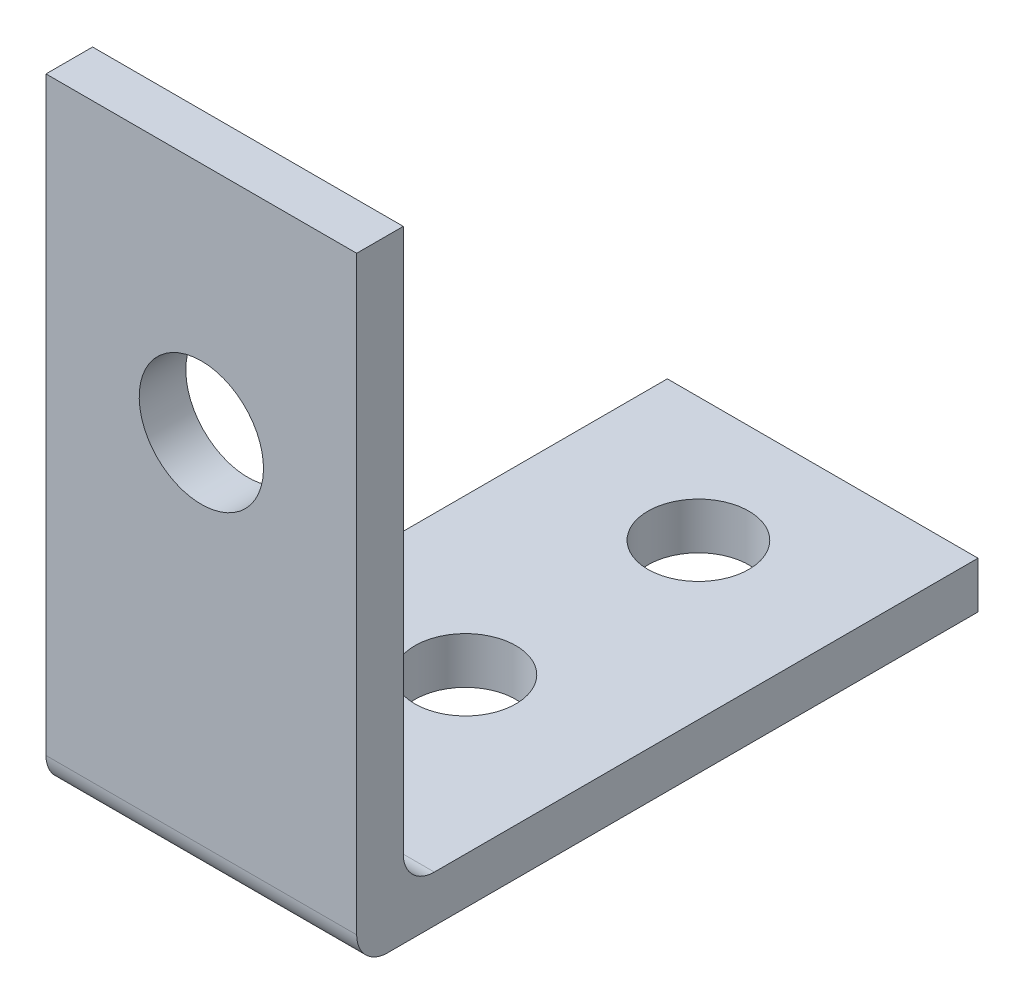
ISO-10303-21;
HEADER;
FILE_DESCRIPTION(('STEP AP214'),'2;1');
FILE_NAME('part.step','',(''),(''),'','','');
FILE_SCHEMA(('AUTOMOTIVE_DESIGN { 1 0 10303 214 1 1 1 1 }'));
ENDSEC;
DATA;
#1=APPLICATION_CONTEXT('core data for automotive mechanical design processes');
#2=APPLICATION_PROTOCOL_DEFINITION('international standard','automotive_design',2000,#1);
#3=PRODUCT_CONTEXT('',#1,'mechanical');
#4=PRODUCT('Part','Part','',(#3));
#5=PRODUCT_RELATED_PRODUCT_CATEGORY('part','',(#4));
#6=PRODUCT_DEFINITION_FORMATION('','',#4);
#7=PRODUCT_DEFINITION_CONTEXT('part definition',#1,'design');
#8=PRODUCT_DEFINITION('design','',#6,#7);
#9=PRODUCT_DEFINITION_SHAPE('','',#8);
#10=(LENGTH_UNIT() NAMED_UNIT(*) SI_UNIT(.MILLI.,.METRE.));
#11=(NAMED_UNIT(*) PLANE_ANGLE_UNIT() SI_UNIT($,.RADIAN.));
#12=(NAMED_UNIT(*) SI_UNIT($,.STERADIAN.) SOLID_ANGLE_UNIT());
#13=UNCERTAINTY_MEASURE_WITH_UNIT(LENGTH_MEASURE(1.E-05),#10,'distance_accuracy_value','');
#14=(GEOMETRIC_REPRESENTATION_CONTEXT(3) GLOBAL_UNCERTAINTY_ASSIGNED_CONTEXT((#13)) GLOBAL_UNIT_ASSIGNED_CONTEXT((#10,
#11,#12)) REPRESENTATION_CONTEXT('',''));
#15=CARTESIAN_POINT('',(0.,0.,0.));
#16=DIRECTION('',(0.,0.,1.));
#17=DIRECTION('',(1.,0.,0.));
#18=AXIS2_PLACEMENT_3D('',#15,#16,#17);
#19=CARTESIAN_POINT('',(20.,40.,0.));
#20=DIRECTION('',(0.,-1.,0.));
#21=DIRECTION('',(0.,0.,-1.));
#22=AXIS2_PLACEMENT_3D('',#19,#20,#21);
#23=PLANE('',#22);
#24=DIRECTION('',(0.,0.,1.));
#25=VECTOR('',#24,1.);
#26=CARTESIAN_POINT('',(0.,40.,0.));
#27=LINE('',#26,#25);
#28=CARTESIAN_POINT('',(0.,40.,-3.));
#29=VERTEX_POINT('',#28);
#30=CARTESIAN_POINT('',(0.,40.,0.));
#31=VERTEX_POINT('',#30);
#32=EDGE_CURVE('E150',#29,#31,#27,.T.);
#33=ORIENTED_EDGE('',*,*,#32,.T.);
#34=DIRECTION('',(-1.,0.,0.));
#35=VECTOR('',#34,1.);
#36=CARTESIAN_POINT('',(20.,40.,0.));
#37=LINE('',#36,#35);
#38=CARTESIAN_POINT('',(20.,40.,0.));
#39=VERTEX_POINT('',#38);
#40=EDGE_CURVE('E11',#39,#31,#37,.T.);
#41=ORIENTED_EDGE('',*,*,#40,.F.);
#42=DIRECTION('',(0.,0.,1.));
#43=VECTOR('',#42,1.);
#44=CARTESIAN_POINT('',(20.,40.,0.));
#45=LINE('',#44,#43);
#46=CARTESIAN_POINT('',(20.,40.,-3.));
#47=VERTEX_POINT('',#46);
#48=EDGE_CURVE('E173',#47,#39,#45,.T.);
#49=ORIENTED_EDGE('',*,*,#48,.F.);
#50=DIRECTION('',(-1.,0.,0.));
#51=VECTOR('',#50,1.);
#52=CARTESIAN_POINT('',(20.,40.,-3.));
#53=LINE('',#52,#51);
#54=EDGE_CURVE('E146',#47,#29,#53,.T.);
#55=ORIENTED_EDGE('',*,*,#54,.T.);
#56=EDGE_LOOP('',(#33,#41,#49,#55));
#57=FACE_BOUND('',#56,.T.);
#58=ADVANCED_FACE('F49',(#57),#23,.F.);
#59=CARTESIAN_POINT('',(20.,2.,0.));
#60=DIRECTION('',(0.,0.,-1.));
#61=DIRECTION('',(0.,1.,0.));
#62=AXIS2_PLACEMENT_3D('',#59,#60,#61);
#63=PLANE('',#62);
#64=CARTESIAN_POINT('',(10.,25.,0.));
#65=DIRECTION('',(0.,0.,-1.));
#66=DIRECTION('',(0.,1.,0.));
#67=AXIS2_PLACEMENT_3D('',#64,#65,#66);
#68=CIRCLE('',#67,4.);
#69=CARTESIAN_POINT('',(10.,29.,0.));
#70=VERTEX_POINT('',#69);
#71=EDGE_CURVE('E155',#70,#70,#68,.T.);
#72=ORIENTED_EDGE('',*,*,#71,.T.);
#73=EDGE_LOOP('',(#72));
#74=FACE_BOUND('',#73,.T.);
#75=DIRECTION('',(0.,-1.,0.));
#76=VECTOR('',#75,1.);
#77=CARTESIAN_POINT('',(0.,2.,0.));
#78=LINE('',#77,#76);
#79=CARTESIAN_POINT('',(0.,2.,0.));
#80=VERTEX_POINT('',#79);
#81=EDGE_CURVE('E154',#31,#80,#78,.T.);
#82=ORIENTED_EDGE('',*,*,#81,.T.);
#83=DIRECTION('',(-1.,0.,0.));
#84=VECTOR('',#83,1.);
#85=CARTESIAN_POINT('',(20.,2.,0.));
#86=LINE('',#85,#84);
#87=CARTESIAN_POINT('',(20.,2.,0.));
#88=VERTEX_POINT('',#87);
#89=EDGE_CURVE('E58',#88,#80,#86,.T.);
#90=ORIENTED_EDGE('',*,*,#89,.F.);
#91=DIRECTION('',(0.,-1.,0.));
#92=VECTOR('',#91,1.);
#93=CARTESIAN_POINT('',(20.,2.,0.));
#94=LINE('',#93,#92);
#95=EDGE_CURVE('E109',#39,#88,#94,.T.);
#96=ORIENTED_EDGE('',*,*,#95,.F.);
#97=ORIENTED_EDGE('',*,*,#40,.T.);
#98=EDGE_LOOP('',(#82,#90,#96,#97));
#99=FACE_BOUND('',#98,.T.);
#100=ADVANCED_FACE('F267',(#74,#99),#63,.F.);
#101=CARTESIAN_POINT('',(20.,2.,-2.));
#102=DIRECTION('',(-1.,0.,0.));
#103=DIRECTION('',(0.,0.,1.));
#104=AXIS2_PLACEMENT_3D('',#101,#102,#103);
#105=CYLINDRICAL_SURFACE('',#104,2.);
#106=CARTESIAN_POINT('',(0.,2.,-2.));
#107=DIRECTION('',(1.,0.,0.));
#108=DIRECTION('',(0.,0.,1.));
#109=AXIS2_PLACEMENT_3D('',#106,#107,#108);
#110=CIRCLE('',#109,2.);
#111=CARTESIAN_POINT('',(0.,0.,-2.));
#112=VERTEX_POINT('',#111);
#113=EDGE_CURVE('E158',#80,#112,#110,.T.);
#114=ORIENTED_EDGE('',*,*,#113,.T.);
#115=DIRECTION('',(-1.,0.,0.));
#116=VECTOR('',#115,1.);
#117=CARTESIAN_POINT('',(20.,0.,-2.));
#118=LINE('',#117,#116);
#119=CARTESIAN_POINT('',(20.,0.,-2.));
#120=VERTEX_POINT('',#119);
#121=EDGE_CURVE('E184',#120,#112,#118,.T.);
#122=ORIENTED_EDGE('',*,*,#121,.F.);
#123=CARTESIAN_POINT('',(20.,2.,-2.));
#124=DIRECTION('',(1.,0.,0.));
#125=DIRECTION('',(0.,0.,1.));
#126=AXIS2_PLACEMENT_3D('',#123,#124,#125);
#127=CIRCLE('',#126,2.);
#128=EDGE_CURVE('E194',#88,#120,#127,.T.);
#129=ORIENTED_EDGE('',*,*,#128,.F.);
#130=ORIENTED_EDGE('',*,*,#89,.T.);
#131=EDGE_LOOP('',(#114,#122,#129,#130));
#132=FACE_BOUND('',#131,.T.);
#133=ADVANCED_FACE('F192',(#132),#105,.T.);
#134=CARTESIAN_POINT('',(20.,0.,-40.));
#135=DIRECTION('',(0.,1.,0.));
#136=DIRECTION('',(0.,0.,1.));
#137=AXIS2_PLACEMENT_3D('',#134,#135,#136);
#138=PLANE('',#137);
#139=CARTESIAN_POINT('',(10.,0.,-32.));
#140=DIRECTION('',(0.,1.,0.));
#141=DIRECTION('',(0.,0.,1.));
#142=AXIS2_PLACEMENT_3D('',#139,#140,#141);
#143=CIRCLE('',#142,3.25);
#144=CARTESIAN_POINT('',(10.,0.,-28.75));
#145=VERTEX_POINT('',#144);
#146=EDGE_CURVE('E221',#145,#145,#143,.T.);
#147=ORIENTED_EDGE('',*,*,#146,.T.);
#148=EDGE_LOOP('',(#147));
#149=FACE_BOUND('',#148,.T.);
#150=CARTESIAN_POINT('',(10.,0.,-17.));
#151=DIRECTION('',(0.,1.,0.));
#152=DIRECTION('',(0.,0.,1.));
#153=AXIS2_PLACEMENT_3D('',#150,#151,#152);
#154=CIRCLE('',#153,3.25);
#155=CARTESIAN_POINT('',(10.,0.,-13.75));
#156=VERTEX_POINT('',#155);
#157=EDGE_CURVE('E225',#156,#156,#154,.T.);
#158=ORIENTED_EDGE('',*,*,#157,.T.);
#159=EDGE_LOOP('',(#158));
#160=FACE_BOUND('',#159,.T.);
#161=DIRECTION('',(0.,0.,-1.));
#162=VECTOR('',#161,1.);
#163=CARTESIAN_POINT('',(0.,0.,-40.));
#164=LINE('',#163,#162);
#165=CARTESIAN_POINT('',(0.,0.,-40.));
#166=VERTEX_POINT('',#165);
#167=EDGE_CURVE('E161',#112,#166,#164,.T.);
#168=ORIENTED_EDGE('',*,*,#167,.T.);
#169=DIRECTION('',(-1.,0.,0.));
#170=VECTOR('',#169,1.);
#171=CARTESIAN_POINT('',(20.,0.,-40.));
#172=LINE('',#171,#170);
#173=CARTESIAN_POINT('',(20.,0.,-40.));
#174=VERTEX_POINT('',#173);
#175=EDGE_CURVE('E180',#174,#166,#172,.T.);
#176=ORIENTED_EDGE('',*,*,#175,.F.);
#177=DIRECTION('',(0.,0.,-1.));
#178=VECTOR('',#177,1.);
#179=CARTESIAN_POINT('',(20.,0.,-40.));
#180=LINE('',#179,#178);
#181=EDGE_CURVE('E207',#120,#174,#180,.T.);
#182=ORIENTED_EDGE('',*,*,#181,.F.);
#183=ORIENTED_EDGE('',*,*,#121,.T.);
#184=EDGE_LOOP('',(#168,#176,#182,#183));
#185=FACE_BOUND('',#184,.T.);
#186=ADVANCED_FACE('F202',(#149,#160,#185),#138,.F.);
#187=CARTESIAN_POINT('',(20.,3.,-40.));
#188=DIRECTION('',(0.,0.,1.));
#189=DIRECTION('',(1.,0.,0.));
#190=AXIS2_PLACEMENT_3D('',#187,#188,#189);
#191=PLANE('',#190);
#192=DIRECTION('',(0.,1.,0.));
#193=VECTOR('',#192,1.);
#194=CARTESIAN_POINT('',(0.,3.,-40.));
#195=LINE('',#194,#193);
#196=CARTESIAN_POINT('',(0.,3.,-40.));
#197=VERTEX_POINT('',#196);
#198=EDGE_CURVE('E164',#166,#197,#195,.T.);
#199=ORIENTED_EDGE('',*,*,#198,.T.);
#200=DIRECTION('',(-1.,0.,0.));
#201=VECTOR('',#200,1.);
#202=CARTESIAN_POINT('',(20.,3.,-40.));
#203=LINE('',#202,#201);
#204=CARTESIAN_POINT('',(20.,3.,-40.));
#205=VERTEX_POINT('',#204);
#206=EDGE_CURVE('E139',#205,#197,#203,.T.);
#207=ORIENTED_EDGE('',*,*,#206,.F.);
#208=DIRECTION('',(0.,1.,0.));
#209=VECTOR('',#208,1.);
#210=CARTESIAN_POINT('',(20.,3.,-40.));
#211=LINE('',#210,#209);
#212=EDGE_CURVE('E128',#174,#205,#211,.T.);
#213=ORIENTED_EDGE('',*,*,#212,.F.);
#214=ORIENTED_EDGE('',*,*,#175,.T.);
#215=EDGE_LOOP('',(#199,#207,#213,#214));
#216=FACE_BOUND('',#215,.T.);
#217=ADVANCED_FACE('F205',(#216),#191,.F.);
#218=CARTESIAN_POINT('',(20.,3.,-5.));
#219=DIRECTION('',(0.,-1.,0.));
#220=DIRECTION('',(0.,0.,-1.));
#221=AXIS2_PLACEMENT_3D('',#218,#219,#220);
#222=PLANE('',#221);
#223=CARTESIAN_POINT('',(10.,3.,-32.));
#224=DIRECTION('',(0.,1.,0.));
#225=DIRECTION('',(0.,0.,1.));
#226=AXIS2_PLACEMENT_3D('',#223,#224,#225);
#227=CIRCLE('',#226,3.25);
#228=CARTESIAN_POINT('',(10.,3.,-28.75));
#229=VERTEX_POINT('',#228);
#230=EDGE_CURVE('E233',#229,#229,#227,.T.);
#231=ORIENTED_EDGE('',*,*,#230,.F.);
#232=EDGE_LOOP('',(#231));
#233=FACE_BOUND('',#232,.T.);
#234=CARTESIAN_POINT('',(10.,3.,-17.));
#235=DIRECTION('',(0.,1.,0.));
#236=DIRECTION('',(0.,0.,1.));
#237=AXIS2_PLACEMENT_3D('',#234,#235,#236);
#238=CIRCLE('',#237,3.25);
#239=CARTESIAN_POINT('',(10.,3.,-13.75));
#240=VERTEX_POINT('',#239);
#241=EDGE_CURVE('E229',#240,#240,#238,.T.);
#242=ORIENTED_EDGE('',*,*,#241,.F.);
#243=EDGE_LOOP('',(#242));
#244=FACE_BOUND('',#243,.T.);
#245=DIRECTION('',(0.,0.,1.));
#246=VECTOR('',#245,1.);
#247=CARTESIAN_POINT('',(0.,3.,-5.));
#248=LINE('',#247,#246);
#249=CARTESIAN_POINT('',(0.,3.,-5.));
#250=VERTEX_POINT('',#249);
#251=EDGE_CURVE('E137',#197,#250,#248,.T.);
#252=ORIENTED_EDGE('',*,*,#251,.T.);
#253=DIRECTION('',(-1.,0.,0.));
#254=VECTOR('',#253,1.);
#255=CARTESIAN_POINT('',(20.,3.,-5.));
#256=LINE('',#255,#254);
#257=CARTESIAN_POINT('',(20.,3.,-5.));
#258=VERTEX_POINT('',#257);
#259=EDGE_CURVE('E134',#258,#250,#256,.T.);
#260=ORIENTED_EDGE('',*,*,#259,.F.);
#261=DIRECTION('',(0.,0.,1.));
#262=VECTOR('',#261,1.);
#263=CARTESIAN_POINT('',(20.,3.,-5.));
#264=LINE('',#263,#262);
#265=EDGE_CURVE('E122',#205,#258,#264,.T.);
#266=ORIENTED_EDGE('',*,*,#265,.F.);
#267=ORIENTED_EDGE('',*,*,#206,.T.);
#268=EDGE_LOOP('',(#252,#260,#266,#267));
#269=FACE_BOUND('',#268,.T.);
#270=ADVANCED_FACE('F135',(#233,#244,#269),#222,.F.);
#271=CARTESIAN_POINT('',(20.,5.,-5.));
#272=DIRECTION('',(-1.,0.,0.));
#273=DIRECTION('',(0.,0.,1.));
#274=AXIS2_PLACEMENT_3D('',#271,#272,#273);
#275=CYLINDRICAL_SURFACE('',#274,2.);
#276=CARTESIAN_POINT('',(0.,5.,-5.));
#277=DIRECTION('',(-1.,0.,0.));
#278=DIRECTION('',(0.,0.,1.));
#279=AXIS2_PLACEMENT_3D('',#276,#277,#278);
#280=CIRCLE('',#279,2.);
#281=CARTESIAN_POINT('',(0.,5.,-3.));
#282=VERTEX_POINT('',#281);
#283=EDGE_CURVE('E95',#250,#282,#280,.T.);
#284=ORIENTED_EDGE('',*,*,#283,.T.);
#285=DIRECTION('',(-1.,0.,0.));
#286=VECTOR('',#285,1.);
#287=CARTESIAN_POINT('',(20.,5.,-3.));
#288=LINE('',#287,#286);
#289=CARTESIAN_POINT('',(20.,5.,-3.));
#290=VERTEX_POINT('',#289);
#291=EDGE_CURVE('E140',#290,#282,#288,.T.);
#292=ORIENTED_EDGE('',*,*,#291,.F.);
#293=CARTESIAN_POINT('',(20.,5.,-5.));
#294=DIRECTION('',(-1.,0.,0.));
#295=DIRECTION('',(0.,0.,1.));
#296=AXIS2_PLACEMENT_3D('',#293,#294,#295);
#297=CIRCLE('',#296,2.);
#298=EDGE_CURVE('E126',#258,#290,#297,.T.);
#299=ORIENTED_EDGE('',*,*,#298,.F.);
#300=ORIENTED_EDGE('',*,*,#259,.T.);
#301=EDGE_LOOP('',(#284,#292,#299,#300));
#302=FACE_BOUND('',#301,.T.);
#303=ADVANCED_FACE('F142',(#302),#275,.F.);
#304=CARTESIAN_POINT('',(20.,40.,-3.));
#305=DIRECTION('',(0.,0.,1.));
#306=DIRECTION('',(0.,-1.,0.));
#307=AXIS2_PLACEMENT_3D('',#304,#305,#306);
#308=PLANE('',#307);
#309=CARTESIAN_POINT('',(10.,25.,-3.));
#310=DIRECTION('',(0.,0.,-1.));
#311=DIRECTION('',(0.,1.,0.));
#312=AXIS2_PLACEMENT_3D('',#309,#310,#311);
#313=CIRCLE('',#312,4.);
#314=CARTESIAN_POINT('',(10.,29.,-3.));
#315=VERTEX_POINT('',#314);
#316=EDGE_CURVE('E217',#315,#315,#313,.T.);
#317=ORIENTED_EDGE('',*,*,#316,.F.);
#318=EDGE_LOOP('',(#317));
#319=FACE_BOUND('',#318,.T.);
#320=DIRECTION('',(0.,1.,0.));
#321=VECTOR('',#320,1.);
#322=CARTESIAN_POINT('',(0.,40.,-3.));
#323=LINE('',#322,#321);
#324=EDGE_CURVE('E101',#282,#29,#323,.T.);
#325=ORIENTED_EDGE('',*,*,#324,.T.);
#326=ORIENTED_EDGE('',*,*,#54,.F.);
#327=DIRECTION('',(0.,1.,0.));
#328=VECTOR('',#327,1.);
#329=CARTESIAN_POINT('',(20.,40.,-3.));
#330=LINE('',#329,#328);
#331=EDGE_CURVE('E66',#290,#47,#330,.T.);
#332=ORIENTED_EDGE('',*,*,#331,.F.);
#333=ORIENTED_EDGE('',*,*,#291,.T.);
#334=EDGE_LOOP('',(#325,#326,#332,#333));
#335=FACE_BOUND('',#334,.T.);
#336=ADVANCED_FACE('F275',(#319,#335),#308,.F.);
#337=CARTESIAN_POINT('',(20.,5.,-5.));
#338=DIRECTION('',(-1.,0.,0.));
#339=DIRECTION('',(0.,0.,1.));
#340=AXIS2_PLACEMENT_3D('',#337,#338,#339);
#341=PLANE('',#340);
#342=ORIENTED_EDGE('',*,*,#48,.T.);
#343=ORIENTED_EDGE('',*,*,#95,.T.);
#344=ORIENTED_EDGE('',*,*,#128,.T.);
#345=ORIENTED_EDGE('',*,*,#181,.T.);
#346=ORIENTED_EDGE('',*,*,#212,.T.);
#347=ORIENTED_EDGE('',*,*,#265,.T.);
#348=ORIENTED_EDGE('',*,*,#298,.T.);
#349=ORIENTED_EDGE('',*,*,#331,.T.);
#350=EDGE_LOOP('',(#342,#343,#344,#345,#346,#347,#348,#349));
#351=FACE_BOUND('',#350,.T.);
#352=ADVANCED_FACE('F124',(#351),#341,.F.);
#353=CARTESIAN_POINT('',(0.,5.,-5.));
#354=DIRECTION('',(-1.,0.,0.));
#355=DIRECTION('',(0.,0.,1.));
#356=AXIS2_PLACEMENT_3D('',#353,#354,#355);
#357=PLANE('',#356);
#358=ORIENTED_EDGE('',*,*,#32,.F.);
#359=ORIENTED_EDGE('',*,*,#324,.F.);
#360=ORIENTED_EDGE('',*,*,#283,.F.);
#361=ORIENTED_EDGE('',*,*,#251,.F.);
#362=ORIENTED_EDGE('',*,*,#198,.F.);
#363=ORIENTED_EDGE('',*,*,#167,.F.);
#364=ORIENTED_EDGE('',*,*,#113,.F.);
#365=ORIENTED_EDGE('',*,*,#81,.F.);
#366=EDGE_LOOP('',(#358,#359,#360,#361,#362,#363,#364,#365));
#367=FACE_BOUND('',#366,.T.);
#368=ADVANCED_FACE('F198',(#367),#357,.T.);
#369=CARTESIAN_POINT('',(10.,25.,0.));
#370=DIRECTION('',(0.,0.,-1.));
#371=DIRECTION('',(0.,1.,0.));
#372=AXIS2_PLACEMENT_3D('',#369,#370,#371);
#373=CYLINDRICAL_SURFACE('',#372,4.);
#374=ORIENTED_EDGE('',*,*,#71,.F.);
#375=EDGE_LOOP('',(#374));
#376=FACE_BOUND('',#375,.T.);
#377=ORIENTED_EDGE('',*,*,#316,.T.);
#378=EDGE_LOOP('',(#377));
#379=FACE_BOUND('',#378,.T.);
#380=ADVANCED_FACE('F256',(#376,#379),#373,.F.);
#381=CARTESIAN_POINT('',(10.,0.,-17.));
#382=DIRECTION('',(0.,1.,0.));
#383=DIRECTION('',(0.,0.,1.));
#384=AXIS2_PLACEMENT_3D('',#381,#382,#383);
#385=CYLINDRICAL_SURFACE('',#384,3.25);
#386=CARTESIAN_POINT('',(10.,0.,-13.75));
#387=CARTESIAN_POINT('',(10.,0.0312499999999968,-13.75));
#388=CARTESIAN_POINT('',(10.,0.0624999999999969,-13.75));
#389=CARTESIAN_POINT('',(10.,0.124999999999997,-13.75));
#390=CARTESIAN_POINT('',(10.,0.156249999999997,-13.75));
#391=CARTESIAN_POINT('',(10.,0.218749999999997,-13.75));
#392=CARTESIAN_POINT('',(10.,0.249999999999997,-13.75));
#393=CARTESIAN_POINT('',(10.,0.312499999999997,-13.75));
#394=CARTESIAN_POINT('',(10.,0.343749999999997,-13.75));
#395=CARTESIAN_POINT('',(10.,0.406249999999997,-13.75));
#396=CARTESIAN_POINT('',(10.,0.437499999999997,-13.75));
#397=CARTESIAN_POINT('',(10.,0.499999999999997,-13.75));
#398=CARTESIAN_POINT('',(10.,0.531249999999997,-13.75));
#399=CARTESIAN_POINT('',(10.,0.593749999999997,-13.75));
#400=CARTESIAN_POINT('',(10.,0.624999999999998,-13.75));
#401=CARTESIAN_POINT('',(10.,0.687499999999998,-13.75));
#402=CARTESIAN_POINT('',(10.,0.718749999999998,-13.75));
#403=CARTESIAN_POINT('',(10.,0.781249999999998,-13.75));
#404=CARTESIAN_POINT('',(10.,0.812499999999998,-13.75));
#405=CARTESIAN_POINT('',(10.,0.874999999999998,-13.75));
#406=CARTESIAN_POINT('',(10.,0.906249999999998,-13.75));
#407=CARTESIAN_POINT('',(10.,0.968749999999998,-13.75));
#408=CARTESIAN_POINT('',(10.,0.999999999999998,-13.75));
#409=CARTESIAN_POINT('',(10.,1.0625,-13.75));
#410=CARTESIAN_POINT('',(10.,1.09375,-13.75));
#411=CARTESIAN_POINT('',(10.,1.15625,-13.75));
#412=CARTESIAN_POINT('',(10.,1.1875,-13.75));
#413=CARTESIAN_POINT('',(10.,1.25,-13.75));
#414=CARTESIAN_POINT('',(10.,1.28125,-13.75));
#415=CARTESIAN_POINT('',(10.,1.34375,-13.75));
#416=CARTESIAN_POINT('',(10.,1.375,-13.75));
#417=CARTESIAN_POINT('',(10.,1.4375,-13.75));
#418=CARTESIAN_POINT('',(10.,1.46875,-13.75));
#419=CARTESIAN_POINT('',(10.,1.53125,-13.75));
#420=CARTESIAN_POINT('',(10.,1.5625,-13.75));
#421=CARTESIAN_POINT('',(10.,1.625,-13.75));
#422=CARTESIAN_POINT('',(10.,1.65625,-13.75));
#423=CARTESIAN_POINT('',(10.,1.71875,-13.75));
#424=CARTESIAN_POINT('',(10.,1.75,-13.75));
#425=CARTESIAN_POINT('',(10.,1.8125,-13.75));
#426=CARTESIAN_POINT('',(10.,1.84375,-13.75));
#427=CARTESIAN_POINT('',(10.,1.90625,-13.75));
#428=CARTESIAN_POINT('',(10.,1.9375,-13.75));
#429=CARTESIAN_POINT('',(10.,2.,-13.75));
#430=CARTESIAN_POINT('',(10.,2.03125,-13.75));
#431=CARTESIAN_POINT('',(10.,2.09375,-13.75));
#432=CARTESIAN_POINT('',(10.,2.125,-13.75));
#433=CARTESIAN_POINT('',(10.,2.1875,-13.75));
#434=CARTESIAN_POINT('',(10.,2.21875,-13.75));
#435=CARTESIAN_POINT('',(10.,2.28125,-13.75));
#436=CARTESIAN_POINT('',(10.,2.3125,-13.75));
#437=CARTESIAN_POINT('',(10.,2.375,-13.75));
#438=CARTESIAN_POINT('',(10.,2.40625,-13.75));
#439=CARTESIAN_POINT('',(10.,2.46875,-13.75));
#440=CARTESIAN_POINT('',(10.,2.5,-13.75));
#441=CARTESIAN_POINT('',(10.,2.5625,-13.75));
#442=CARTESIAN_POINT('',(10.,2.59375,-13.75));
#443=CARTESIAN_POINT('',(10.,2.65625,-13.75));
#444=CARTESIAN_POINT('',(10.,2.6875,-13.75));
#445=CARTESIAN_POINT('',(10.,2.75,-13.75));
#446=CARTESIAN_POINT('',(10.,2.78125,-13.75));
#447=CARTESIAN_POINT('',(10.,2.84375,-13.75));
#448=CARTESIAN_POINT('',(10.,2.875,-13.75));
#449=CARTESIAN_POINT('',(10.,2.9375,-13.75));
#450=CARTESIAN_POINT('',(10.,2.96875,-13.75));
#451=CARTESIAN_POINT('',(10.,3.,-13.75));
#452=B_SPLINE_CURVE_WITH_KNOTS('',3,(#386,#387,#388,#389,#390,#391,#392,#393,#394,#395,#396,
#397,#398,#399,#400,#401,#402,#403,#404,#405,#406,#407,#408,#409,#410,#411,#412,#413,#414,#415,
#416,#417,#418,#419,#420,#421,#422,#423,#424,#425,#426,#427,#428,#429,#430,#431,#432,#433,#434,
#435,#436,#437,#438,#439,#440,#441,#442,#443,#444,#445,#446,#447,#448,#449,#450,#451),
.UNSPECIFIED.,.F.,.F.,(4,2,2,2,2,2,2,2,2,2,2,2,2,2,2,2,2,2,2,2,2,2,2,2,2,2,2,2,2,2,2,2,4),(0.,
0.0937500000000001,0.1875,0.28125,0.375,0.46875,0.562500000000001,0.656250000000001,
0.750000000000001,0.843750000000001,0.937500000000001,1.03125,1.125,1.21875,1.3125,1.40625,1.5,
1.59375,1.6875,1.78125,1.875,1.96875,2.0625,2.15625,2.25,2.34375,2.4375,2.53125,2.625,2.71875,
2.8125,2.90625,3.),.UNSPECIFIED.);
#453=EDGE_CURVE('BSEAM246',#156,#240,#452,.T.);
#454=ORIENTED_EDGE('',*,*,#157,.F.);
#455=ORIENTED_EDGE('',*,*,#241,.T.);
#456=ORIENTED_EDGE('',*,*,#453,.T.);
#457=ORIENTED_EDGE('',*,*,#453,.F.);
#458=EDGE_LOOP('',(#454,#456,#455,#457));
#459=FACE_BOUND('',#458,.T.);
#460=ADVANCED_FACE('F246',(#459),#385,.F.);
#461=CARTESIAN_POINT('',(10.,0.,-32.));
#462=DIRECTION('',(0.,1.,0.));
#463=DIRECTION('',(0.,0.,1.));
#464=AXIS2_PLACEMENT_3D('',#461,#462,#463);
#465=CYLINDRICAL_SURFACE('',#464,3.25);
#466=CARTESIAN_POINT('',(10.,0.,-28.75));
#467=CARTESIAN_POINT('',(10.,0.0312499999999977,-28.75));
#468=CARTESIAN_POINT('',(10.,0.0624999999999978,-28.75));
#469=CARTESIAN_POINT('',(10.,0.124999999999998,-28.75));
#470=CARTESIAN_POINT('',(10.,0.156249999999998,-28.75));
#471=CARTESIAN_POINT('',(10.,0.218749999999998,-28.75));
#472=CARTESIAN_POINT('',(10.,0.249999999999998,-28.75));
#473=CARTESIAN_POINT('',(10.,0.312499999999998,-28.75));
#474=CARTESIAN_POINT('',(10.,0.343749999999998,-28.75));
#475=CARTESIAN_POINT('',(10.,0.406249999999998,-28.75));
#476=CARTESIAN_POINT('',(10.,0.437499999999998,-28.75));
#477=CARTESIAN_POINT('',(10.,0.499999999999998,-28.75));
#478=CARTESIAN_POINT('',(10.,0.531249999999998,-28.75));
#479=CARTESIAN_POINT('',(10.,0.593749999999998,-28.75));
#480=CARTESIAN_POINT('',(10.,0.624999999999998,-28.75));
#481=CARTESIAN_POINT('',(10.,0.687499999999998,-28.75));
#482=CARTESIAN_POINT('',(10.,0.718749999999998,-28.75));
#483=CARTESIAN_POINT('',(10.,0.781249999999999,-28.75));
#484=CARTESIAN_POINT('',(10.,0.812499999999999,-28.75));
#485=CARTESIAN_POINT('',(10.,0.874999999999999,-28.75));
#486=CARTESIAN_POINT('',(10.,0.906249999999999,-28.75));
#487=CARTESIAN_POINT('',(10.,0.968749999999999,-28.75));
#488=CARTESIAN_POINT('',(10.,0.999999999999999,-28.75));
#489=CARTESIAN_POINT('',(10.,1.0625,-28.75));
#490=CARTESIAN_POINT('',(10.,1.09375,-28.75));
#491=CARTESIAN_POINT('',(10.,1.15625,-28.75));
#492=CARTESIAN_POINT('',(10.,1.1875,-28.75));
#493=CARTESIAN_POINT('',(10.,1.25,-28.75));
#494=CARTESIAN_POINT('',(10.,1.28125,-28.75));
#495=CARTESIAN_POINT('',(10.,1.34375,-28.75));
#496=CARTESIAN_POINT('',(10.,1.375,-28.75));
#497=CARTESIAN_POINT('',(10.,1.4375,-28.75));
#498=CARTESIAN_POINT('',(10.,1.46875,-28.75));
#499=CARTESIAN_POINT('',(10.,1.53125,-28.75));
#500=CARTESIAN_POINT('',(10.,1.5625,-28.75));
#501=CARTESIAN_POINT('',(10.,1.625,-28.75));
#502=CARTESIAN_POINT('',(10.,1.65625,-28.75));
#503=CARTESIAN_POINT('',(10.,1.71875,-28.75));
#504=CARTESIAN_POINT('',(10.,1.75,-28.75));
#505=CARTESIAN_POINT('',(10.,1.8125,-28.75));
#506=CARTESIAN_POINT('',(10.,1.84375,-28.75));
#507=CARTESIAN_POINT('',(10.,1.90625,-28.75));
#508=CARTESIAN_POINT('',(10.,1.9375,-28.75));
#509=CARTESIAN_POINT('',(10.,2.,-28.75));
#510=CARTESIAN_POINT('',(10.,2.03125,-28.75));
#511=CARTESIAN_POINT('',(10.,2.09375,-28.75));
#512=CARTESIAN_POINT('',(10.,2.125,-28.75));
#513=CARTESIAN_POINT('',(10.,2.1875,-28.75));
#514=CARTESIAN_POINT('',(10.,2.21875,-28.75));
#515=CARTESIAN_POINT('',(10.,2.28125,-28.75));
#516=CARTESIAN_POINT('',(10.,2.3125,-28.75));
#517=CARTESIAN_POINT('',(10.,2.375,-28.75));
#518=CARTESIAN_POINT('',(10.,2.40625,-28.75));
#519=CARTESIAN_POINT('',(10.,2.46875,-28.75));
#520=CARTESIAN_POINT('',(10.,2.5,-28.75));
#521=CARTESIAN_POINT('',(10.,2.5625,-28.75));
#522=CARTESIAN_POINT('',(10.,2.59375,-28.75));
#523=CARTESIAN_POINT('',(10.,2.65625,-28.75));
#524=CARTESIAN_POINT('',(10.,2.6875,-28.75));
#525=CARTESIAN_POINT('',(10.,2.75,-28.75));
#526=CARTESIAN_POINT('',(10.,2.78125,-28.75));
#527=CARTESIAN_POINT('',(10.,2.84375,-28.75));
#528=CARTESIAN_POINT('',(10.,2.875,-28.75));
#529=CARTESIAN_POINT('',(10.,2.9375,-28.75));
#530=CARTESIAN_POINT('',(10.,2.96875,-28.75));
#531=CARTESIAN_POINT('',(10.,3.,-28.75));
#532=B_SPLINE_CURVE_WITH_KNOTS('',3,(#466,#467,#468,#469,#470,#471,#472,#473,#474,#475,#476,
#477,#478,#479,#480,#481,#482,#483,#484,#485,#486,#487,#488,#489,#490,#491,#492,#493,#494,#495,
#496,#497,#498,#499,#500,#501,#502,#503,#504,#505,#506,#507,#508,#509,#510,#511,#512,#513,#514,
#515,#516,#517,#518,#519,#520,#521,#522,#523,#524,#525,#526,#527,#528,#529,#530,#531),
.UNSPECIFIED.,.F.,.F.,(4,2,2,2,2,2,2,2,2,2,2,2,2,2,2,2,2,2,2,2,2,2,2,2,2,2,2,2,2,2,2,2,4),(0.,
0.0937500000000001,0.1875,0.28125,0.375,0.46875,0.562500000000001,0.656250000000001,
0.750000000000001,0.843750000000001,0.937500000000001,1.03125,1.125,1.21875,1.3125,1.40625,1.5,
1.59375,1.6875,1.78125,1.875,1.96875,2.0625,2.15625,2.25,2.34375,2.4375,2.53125,2.625,2.71875,
2.8125,2.90625,3.),.UNSPECIFIED.);
#533=EDGE_CURVE('BSEAM243',#145,#229,#532,.T.);
#534=ORIENTED_EDGE('',*,*,#146,.F.);
#535=ORIENTED_EDGE('',*,*,#230,.T.);
#536=ORIENTED_EDGE('',*,*,#533,.T.);
#537=ORIENTED_EDGE('',*,*,#533,.F.);
#538=EDGE_LOOP('',(#534,#536,#535,#537));
#539=FACE_BOUND('',#538,.T.);
#540=ADVANCED_FACE('F243',(#539),#465,.F.);
#541=CLOSED_SHELL('',(#58,#100,#133,#186,#217,#270,#303,#336,#352,#368,#380,#460,#540));
#542=MANIFOLD_SOLID_BREP('B2',#541);
#543=ADVANCED_BREP_SHAPE_REPRESENTATION('',(#18,#542),#14);
#544=SHAPE_DEFINITION_REPRESENTATION(#9,#543);
ENDSEC;
END-ISO-10303-21;
